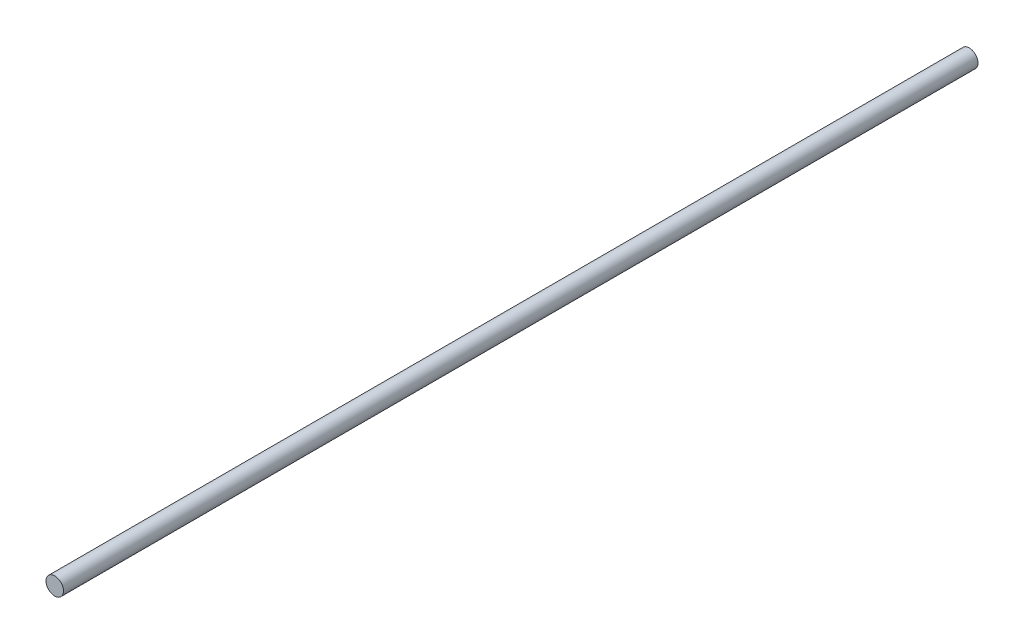
ISO-10303-21;
HEADER;
FILE_DESCRIPTION(('STEP AP214'),'2;1');
FILE_NAME('part.step','',(''),(''),'','','');
FILE_SCHEMA(('AUTOMOTIVE_DESIGN { 1 0 10303 214 1 1 1 1 }'));
ENDSEC;
DATA;
#1=APPLICATION_CONTEXT('core data for automotive mechanical design processes');
#2=APPLICATION_PROTOCOL_DEFINITION('international standard','automotive_design',2000,#1);
#3=PRODUCT_CONTEXT('',#1,'mechanical');
#4=PRODUCT('Part','Part','',(#3));
#5=PRODUCT_RELATED_PRODUCT_CATEGORY('part','',(#4));
#6=PRODUCT_DEFINITION_FORMATION('','',#4);
#7=PRODUCT_DEFINITION_CONTEXT('part definition',#1,'design');
#8=PRODUCT_DEFINITION('design','',#6,#7);
#9=PRODUCT_DEFINITION_SHAPE('','',#8);
#10=(LENGTH_UNIT() NAMED_UNIT(*) SI_UNIT(.MILLI.,.METRE.));
#11=(NAMED_UNIT(*) PLANE_ANGLE_UNIT() SI_UNIT($,.RADIAN.));
#12=(NAMED_UNIT(*) SI_UNIT($,.STERADIAN.) SOLID_ANGLE_UNIT());
#13=UNCERTAINTY_MEASURE_WITH_UNIT(LENGTH_MEASURE(1.E-05),#10,'distance_accuracy_value','');
#14=(GEOMETRIC_REPRESENTATION_CONTEXT(3) GLOBAL_UNCERTAINTY_ASSIGNED_CONTEXT((#13)) GLOBAL_UNIT_ASSIGNED_CONTEXT((#10,
#11,#12)) REPRESENTATION_CONTEXT('',''));
#15=CARTESIAN_POINT('',(0.,0.,0.));
#16=DIRECTION('',(0.,0.,1.));
#17=DIRECTION('',(1.,0.,0.));
#18=AXIS2_PLACEMENT_3D('',#15,#16,#17);
#19=CARTESIAN_POINT('',(0.,0.,0.));
#20=DIRECTION('',(0.,0.,1.));
#21=DIRECTION('',(1.,0.,0.));
#22=AXIS2_PLACEMENT_3D('',#19,#20,#21);
#23=CYLINDRICAL_SURFACE('',#22,3.25);
#24=CARTESIAN_POINT('',(0.,0.,0.));
#25=DIRECTION('',(0.,0.,1.));
#26=DIRECTION('',(1.,0.,0.));
#27=AXIS2_PLACEMENT_3D('',#24,#25,#26);
#28=CIRCLE('',#27,3.25);
#29=CARTESIAN_POINT('',(3.25,0.,0.));
#30=VERTEX_POINT('',#29);
#31=EDGE_CURVE('E10',#30,#30,#28,.T.);
#32=ORIENTED_EDGE('',*,*,#31,.T.);
#33=EDGE_LOOP('',(#32));
#34=FACE_BOUND('',#33,.T.);
#35=CARTESIAN_POINT('',(0.,0.,340.));
#36=DIRECTION('',(0.,0.,1.));
#37=DIRECTION('',(1.,0.,0.));
#38=AXIS2_PLACEMENT_3D('',#35,#36,#37);
#39=CIRCLE('',#38,3.25);
#40=CARTESIAN_POINT('',(3.25,0.,340.));
#41=VERTEX_POINT('',#40);
#42=EDGE_CURVE('E39',#41,#41,#39,.T.);
#43=ORIENTED_EDGE('',*,*,#42,.F.);
#44=EDGE_LOOP('',(#43));
#45=FACE_BOUND('',#44,.T.);
#46=ADVANCED_FACE('F33',(#34,#45),#23,.T.);
#47=CARTESIAN_POINT('',(3.25,0.,0.));
#48=DIRECTION('',(0.,0.,-1.));
#49=DIRECTION('',(-1.,0.,0.));
#50=AXIS2_PLACEMENT_3D('',#47,#48,#49);
#51=PLANE('',#50);
#52=ORIENTED_EDGE('',*,*,#31,.F.);
#53=EDGE_LOOP('',(#52));
#54=FACE_BOUND('',#53,.T.);
#55=ADVANCED_FACE('F48',(#54),#51,.T.);
#56=CARTESIAN_POINT('',(0.,0.,340.));
#57=DIRECTION('',(0.,0.,1.));
#58=DIRECTION('',(1.,0.,0.));
#59=AXIS2_PLACEMENT_3D('',#56,#57,#58);
#60=PLANE('',#59);
#61=ORIENTED_EDGE('',*,*,#42,.T.);
#62=EDGE_LOOP('',(#61));
#63=FACE_BOUND('',#62,.T.);
#64=ADVANCED_FACE('F45',(#63),#60,.T.);
#65=CLOSED_SHELL('',(#46,#55,#64));
#66=MANIFOLD_SOLID_BREP('B2',#65);
#67=ADVANCED_BREP_SHAPE_REPRESENTATION('',(#18,#66),#14);
#68=SHAPE_DEFINITION_REPRESENTATION(#9,#67);
ENDSEC;
END-ISO-10303-21;
